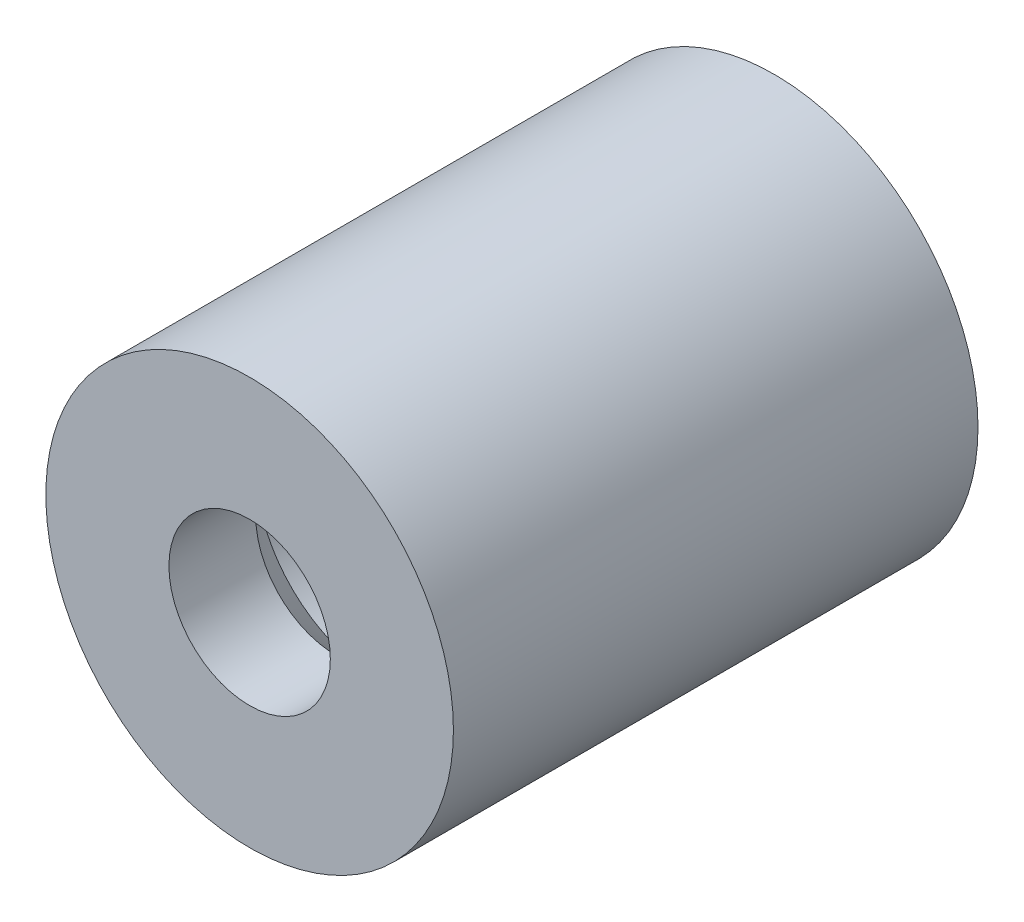
ISO-10303-21;
HEADER;
FILE_DESCRIPTION(('STEP AP214'),'2;1');
FILE_NAME('part.step','',(''),(''),'','','');
FILE_SCHEMA(('AUTOMOTIVE_DESIGN { 1 0 10303 214 1 1 1 1 }'));
ENDSEC;
DATA;
#1=APPLICATION_CONTEXT('core data for automotive mechanical design processes');
#2=APPLICATION_PROTOCOL_DEFINITION('international standard','automotive_design',2000,#1);
#3=PRODUCT_CONTEXT('',#1,'mechanical');
#4=PRODUCT('Part','Part','',(#3));
#5=PRODUCT_RELATED_PRODUCT_CATEGORY('part','',(#4));
#6=PRODUCT_DEFINITION_FORMATION('','',#4);
#7=PRODUCT_DEFINITION_CONTEXT('part definition',#1,'design');
#8=PRODUCT_DEFINITION('design','',#6,#7);
#9=PRODUCT_DEFINITION_SHAPE('','',#8);
#10=(LENGTH_UNIT() NAMED_UNIT(*) SI_UNIT(.MILLI.,.METRE.));
#11=(NAMED_UNIT(*) PLANE_ANGLE_UNIT() SI_UNIT($,.RADIAN.));
#12=(NAMED_UNIT(*) SI_UNIT($,.STERADIAN.) SOLID_ANGLE_UNIT());
#13=UNCERTAINTY_MEASURE_WITH_UNIT(LENGTH_MEASURE(1.E-05),#10,'distance_accuracy_value','');
#14=(GEOMETRIC_REPRESENTATION_CONTEXT(3) GLOBAL_UNCERTAINTY_ASSIGNED_CONTEXT((#13)) GLOBAL_UNIT_ASSIGNED_CONTEXT((#10,
#11,#12)) REPRESENTATION_CONTEXT('',''));
#15=CARTESIAN_POINT('',(0.,0.,0.));
#16=DIRECTION('',(0.,0.,1.));
#17=DIRECTION('',(1.,0.,0.));
#18=AXIS2_PLACEMENT_3D('',#15,#16,#17);
#19=CARTESIAN_POINT('',(0.,0.,11.));
#20=DIRECTION('',(0.,0.,-1.));
#21=DIRECTION('',(-1.,0.,0.));
#22=AXIS2_PLACEMENT_3D('',#19,#20,#21);
#23=CYLINDRICAL_SURFACE('',#22,3.05);
#24=CARTESIAN_POINT('',(0.,0.,9.79999999999998));
#25=DIRECTION('',(0.,0.,1.));
#26=DIRECTION('',(1.,0.,0.));
#27=AXIS2_PLACEMENT_3D('',#24,#25,#26);
#28=CIRCLE('',#27,3.05);
#29=CARTESIAN_POINT('',(-3.05,0.,9.79999999999998));
#30=VERTEX_POINT('',#29);
#31=EDGE_CURVE('E58',#30,#30,#28,.T.);
#32=ORIENTED_EDGE('',*,*,#31,.T.);
#33=EDGE_LOOP('',(#32));
#34=FACE_BOUND('',#33,.T.);
#35=CARTESIAN_POINT('',(0.,-3.05,4.6));
#36=CARTESIAN_POINT('',(-0.0836110050453581,-3.04999517700509,4.59999455650101));
#37=CARTESIAN_POINT('',(-0.167306428380569,-3.04652589814843,4.59340785872216));
#38=CARTESIAN_POINT('',(-0.332191821665101,-3.03298901559862,4.56736761047759));
#39=CARTESIAN_POINT('',(-0.41337744453983,-3.02291056912914,4.54789291591933));
#40=CARTESIAN_POINT('',(-0.570613153127324,-2.99720260155738,4.49706399807992));
#41=CARTESIAN_POINT('',(-0.64668239885405,-2.98159534164387,4.46575738147327));
#42=CARTESIAN_POINT('',(-0.792357900481189,-2.94623419512776,4.39241738866397));
#43=CARTESIAN_POINT('',(-0.861964263345972,-2.92648037717069,4.35038419003549));
#44=CARTESIAN_POINT('',(-0.997798318782131,-2.88310679073146,4.25371076067794));
#45=CARTESIAN_POINT('',(-1.06351666988197,-2.859319653945,4.19843117858787));
#46=CARTESIAN_POINT('',(-1.18522587445246,-2.81105572902165,4.07822360035397));
#47=CARTESIAN_POINT('',(-1.24120850706307,-2.78657837813787,4.01328753525379));
#48=CARTESIAN_POINT('',(-1.3467876012229,-2.73721560194913,3.86882083429098));
#49=CARTESIAN_POINT('',(-1.39539667719393,-2.71248186972032,3.78851034451157));
#50=CARTESIAN_POINT('',(-1.47821785577007,-2.66825595257666,3.61944545804245));
#51=CARTESIAN_POINT('',(-1.51244089981633,-2.64875978826508,3.53069754174642));
#52=CARTESIAN_POINT('',(-1.56317686282866,-2.61912187860583,3.35282461369514));
#53=CARTESIAN_POINT('',(-1.5806560469441,-2.60847521031483,3.26406395204097));
#54=CARTESIAN_POINT('',(-1.60032679539884,-2.59645976696876,3.08428674524894));
#55=CARTESIAN_POINT('',(-1.60253644934951,-2.59508001357605,2.99327299770228));
#56=CARTESIAN_POINT('',(-1.59231112345977,-2.60135681056238,2.82481316320863));
#57=CARTESIAN_POINT('',(-1.58181195806415,-2.60781918576659,2.74719343145767));
#58=CARTESIAN_POINT('',(-1.54985517155484,-2.62693591844801,2.59503685895057));
#59=CARTESIAN_POINT('',(-1.52839341169479,-2.63959261441304,2.5205011940298));
#60=CARTESIAN_POINT('',(-1.47477217782312,-2.66992681382473,2.37451021239191));
#61=CARTESIAN_POINT('',(-1.44237993660731,-2.68771221954179,2.30316388490232));
#62=CARTESIAN_POINT('',(-1.36800477135078,-2.7263193459757,2.16656234914093));
#63=CARTESIAN_POINT('',(-1.32601756253087,-2.74714242170351,2.10130988056908));
#64=CARTESIAN_POINT('',(-1.22673326593071,-2.79303030943981,1.96903155683991));
#65=CARTESIAN_POINT('',(-1.16811065163519,-2.81827847110633,1.90306057289718));
#66=CARTESIAN_POINT('',(-1.04059337899233,-2.86781214667249,1.78142080073434));
#67=CARTESIAN_POINT('',(-0.971692869974617,-2.89209710223632,1.72575792109897));
#68=CARTESIAN_POINT('',(-0.820740647513362,-2.93861464263574,1.6233543393171));
#69=CARTESIAN_POINT('',(-0.738169212285077,-2.96065672738557,1.57728596283712));
#70=CARTESIAN_POINT('',(-0.565004905102359,-2.99851580446222,1.50008897506982));
#71=CARTESIAN_POINT('',(-0.474419068631023,-3.01433819164323,1.46894741136602));
#72=CARTESIAN_POINT('',(-0.296343036097651,-3.03677685758856,1.42525207958017));
#73=CARTESIAN_POINT('',(-0.209283174619134,-3.04408137162577,1.41130246738174));
#74=CARTESIAN_POINT('',(-0.0337678143322873,-3.05107459307041,1.3979411600416));
#75=CARTESIAN_POINT('',(0.0546868918974522,-3.05076748003652,1.39852148648514));
#76=CARTESIAN_POINT('',(0.222261120633014,-3.04294690530863,1.41347654786282));
#77=CARTESIAN_POINT('',(0.301522473378709,-3.03606369806689,1.42664490565815));
#78=CARTESIAN_POINT('',(0.456527872639768,-3.01665136822864,1.46443893700297));
#79=CARTESIAN_POINT('',(0.532271546832611,-3.00412164948249,1.48906582033417));
#80=CARTESIAN_POINT('',(0.680409637622107,-2.97412294261102,1.5496154206314));
#81=CARTESIAN_POINT('',(0.752665352454752,-2.95653375763504,1.58581575597123));
#82=CARTESIAN_POINT('',(0.890294387704053,-2.91804565699983,1.6681537821101));
#83=CARTESIAN_POINT('',(0.955664928691706,-2.89714541318244,1.71429546334583));
#84=CARTESIAN_POINT('',(1.08498511623705,-2.85140171616678,1.82078716825914));
#85=CARTESIAN_POINT('',(1.14806026144041,-2.82637478821565,1.88212172109822));
#86=CARTESIAN_POINT('',(1.26345922508927,-2.77671130755486,2.01441119365976));
#87=CARTESIAN_POINT('',(1.31577375066828,-2.7520751090808,2.08537434160053));
#88=CARTESIAN_POINT('',(1.41129657900498,-2.70439793263665,2.2403745197948));
#89=CARTESIAN_POINT('',(1.45373748753615,-2.6815510703486,2.32494981651054));
#90=CARTESIAN_POINT('',(1.52334205942745,-2.64263875687894,2.50159483835204));
#91=CARTESIAN_POINT('',(1.55052704827709,-2.62656384740357,2.59365389503911));
#92=CARTESIAN_POINT('',(1.58620051535253,-2.60516086699517,2.77307748344927));
#93=CARTESIAN_POINT('',(1.59625878046835,-2.59893477717467,2.86001932668319));
#94=CARTESIAN_POINT('',(1.60200350958647,-2.59540043680358,3.03453714083777));
#95=CARTESIAN_POINT('',(1.59769866270163,-2.5980867945703,3.12211269639874));
#96=CARTESIAN_POINT('',(1.57634037251977,-2.6110861836083,3.28479140400219));
#97=CARTESIAN_POINT('',(1.56080020023768,-2.62049247072563,3.36017609553527));
#98=CARTESIAN_POINT('',(1.51941962429058,-2.64469943748282,3.5071449722835));
#99=CARTESIAN_POINT('',(1.49357556899147,-2.65950202938117,3.57872779993836));
#100=CARTESIAN_POINT('',(1.43045670677683,-2.69400519922494,3.7212953716003));
#101=CARTESIAN_POINT('',(1.39254346462315,-2.71396330851015,3.79193309027499));
#102=CARTESIAN_POINT('',(1.30701559790143,-2.7561720524641,3.9263162731664));
#103=CARTESIAN_POINT('',(1.25939575644109,-2.7784239167382,3.99005800275725));
#104=CARTESIAN_POINT('',(1.14810442822523,-2.82639569886052,4.118036575794));
#105=CARTESIAN_POINT('',(1.08312351653135,-2.85216935720769,4.18112091253596));
#106=CARTESIAN_POINT('',(0.942903791930803,-2.9015436493127,4.29581536913892));
#107=CARTESIAN_POINT('',(0.867658720167138,-2.92514294236523,4.3474184370686));
#108=CARTESIAN_POINT('',(0.706919773010004,-2.96813330877579,4.43838586255544));
#109=CARTESIAN_POINT('',(0.621256595958553,-2.98743470182243,4.47749570553711));
#110=CARTESIAN_POINT('',(0.443338336959858,-3.01894839595394,4.54022493559491));
#111=CARTESIAN_POINT('',(0.35110195214757,-3.03117996852047,4.5638864560046));
#112=CARTESIAN_POINT('',(0.214843288011331,-3.04272489307524,4.5860963019435));
#113=CARTESIAN_POINT('',(0.172094969544414,-3.04544427350963,4.59130106575374));
#114=CARTESIAN_POINT('',(0.0862385933399975,-3.04908308883221,4.59825435315199));
#115=CARTESIAN_POINT('',(0.0431305284664786,-3.0500024879299,4.60000280801538));
#116=CARTESIAN_POINT('',(0.,-3.05,4.6));
#117=B_SPLINE_CURVE_WITH_KNOTS('',3,(#35,#36,#37,#38,#39,#40,#41,#42,#43,#44,#45,#46,#47,#48,
#49,#50,#51,#52,#53,#54,#55,#56,#57,#58,#59,#60,#61,#62,#63,#64,#65,#66,#67,#68,#69,#70,#71,#72,
#73,#74,#75,#76,#77,#78,#79,#80,#81,#82,#83,#84,#85,#86,#87,#88,#89,#90,#91,#92,#93,#94,#95,#96,
#97,#98,#99,#100,#101,#102,#103,#104,#105,#106,#107,#108,#109,#110,#111,#112,#113,#114,#115,
#116),.UNSPECIFIED.,.T.,.F.,(4,2,2,2,2,2,2,2,2,2,2,2,2,2,2,2,2,2,2,2,2,2,2,2,2,2,2,2,2,2,2,2,2,
2,2,2,2,2,2,2,4),(0.,0.250658754208306,0.501729762912424,0.751801140503482,1.00186837853366,
1.26810210223369,1.53455955403315,1.82433168016992,2.1138830166977,2.38548666885169,
2.65676850048792,2.89144544038274,3.12621104423379,3.36632969040414,3.60655577548953,
3.88076383655907,4.15512858991027,4.44482381121524,4.73426719867742,4.99821133082684,
5.26201053397124,5.50282368426325,5.74366226518102,5.99077646561658,6.23799004262053,
6.51123596988036,6.78471689052737,7.07518363207381,7.36524332677427,7.62690724924094,
7.88841290412563,8.12003101787473,8.35173128875636,8.5986251672399,8.84565209243475,
9.12686877824567,9.40825771675036,9.69505938135874,9.98107552659207,10.1103746489914,
10.2396763423257),.UNSPECIFIED.);
#118=CARTESIAN_POINT('',(0.,-3.05,4.6));
#119=VERTEX_POINT('',#118);
#120=EDGE_CURVE('E78',#119,#119,#117,.T.);
#121=ORIENTED_EDGE('',*,*,#120,.T.);
#122=EDGE_LOOP('',(#121));
#123=FACE_BOUND('',#122,.T.);
#124=CARTESIAN_POINT('',(0.,0.,0.));
#125=DIRECTION('',(0.,0.,1.));
#126=DIRECTION('',(1.,0.,0.));
#127=AXIS2_PLACEMENT_3D('',#124,#125,#126);
#128=CIRCLE('',#127,3.05);
#129=CARTESIAN_POINT('',(3.05,0.,0.));
#130=VERTEX_POINT('',#129);
#131=EDGE_CURVE('E66',#130,#130,#128,.T.);
#132=ORIENTED_EDGE('',*,*,#131,.F.);
#133=EDGE_LOOP('',(#132));
#134=FACE_BOUND('',#133,.T.);
#135=ADVANCED_FACE('F50',(#34,#123,#134),#23,.F.);
#136=CARTESIAN_POINT('',(0.,0.,11.));
#137=DIRECTION('',(0.,0.,-1.));
#138=DIRECTION('',(-1.,0.,0.));
#139=AXIS2_PLACEMENT_3D('',#136,#137,#138);
#140=CYLINDRICAL_SURFACE('',#139,5.05);
#141=CARTESIAN_POINT('',(0.,-5.05,4.6));
#142=CARTESIAN_POINT('',(-0.0875409998517804,-5.04999968854448,4.5999996146656));
#143=CARTESIAN_POINT('',(-0.175086287920633,-5.04770234799848,4.59279192078489));
#144=CARTESIAN_POINT('',(-0.347612892298866,-5.03876311669709,4.56422970859236));
#145=CARTESIAN_POINT('',(-0.432593689370447,-5.03212035220745,4.54287234519592));
#146=CARTESIAN_POINT('',(-0.597478664125252,-5.0152151624065,4.48680601371964));
#147=CARTESIAN_POINT('',(-0.67739059958267,-5.00495843402861,4.45211805179648));
#148=CARTESIAN_POINT('',(-0.830263531219146,-4.98188185833633,4.37046569774811));
#149=CARTESIAN_POINT('',(-0.90322337097563,-4.96906158569309,4.32349926805046));
#150=CARTESIAN_POINT('',(-1.04243070697758,-4.94176252093728,4.21705899245297));
#151=CARTESIAN_POINT('',(-1.10842736008114,-4.92724685042671,4.15726658080544));
#152=CARTESIAN_POINT('',(-1.22964402275218,-4.89840438560033,4.02754970657174));
#153=CARTESIAN_POINT('',(-1.28486195453099,-4.88407762819619,3.95762329499609));
#154=CARTESIAN_POINT('',(-1.38432833222612,-4.85683738526605,3.8074342683838));
#155=CARTESIAN_POINT('',(-1.42826084216015,-4.84396930214838,3.72695339829055));
#156=CARTESIAN_POINT('',(-1.50186271557363,-4.82165928286893,3.55927206388807));
#157=CARTESIAN_POINT('',(-1.5315359557618,-4.8122164156552,3.47207343344476));
#158=CARTESIAN_POINT('',(-1.57485438998285,-4.79821225332726,3.29626706120927));
#159=CARTESIAN_POINT('',(-1.5889658831513,-4.79350932611333,3.20778581507909));
#160=CARTESIAN_POINT('',(-1.60221724513353,-4.7890973254852,3.029596248905));
#161=CARTESIAN_POINT('',(-1.6013612222925,-4.78938688171337,2.93988827233418));
#162=CARTESIAN_POINT('',(-1.58506601670005,-4.7948022964149,2.76567274496443));
#163=CARTESIAN_POINT('',(-1.57022273075002,-4.79973052457942,2.6811022730107));
#164=CARTESIAN_POINT('',(-1.5273417148178,-4.81354646727671,2.5157199720337));
#165=CARTESIAN_POINT('',(-1.49930254680973,-4.82243461333729,2.43490855370954));
#166=CARTESIAN_POINT('',(-1.4304112003053,-4.84331819883662,2.27793215859232));
#167=CARTESIAN_POINT('',(-1.38937406995172,-4.8553580260966,2.20185450965919));
#168=CARTESIAN_POINT('',(-1.29578011994086,-4.88116840659655,2.05747120183003));
#169=CARTESIAN_POINT('',(-1.24322023813672,-4.89493941947968,1.9891676162188));
#170=CARTESIAN_POINT('',(-1.12516129001637,-4.92345026245478,1.85890651262089));
#171=CARTESIAN_POINT('',(-1.05917123772441,-4.93820524930159,1.79739646767223));
#172=CARTESIAN_POINT('',(-0.917629342833674,-4.96645322355614,1.68620541900344));
#173=CARTESIAN_POINT('',(-0.84207675248564,-4.97994611212958,1.63652534121203));
#174=CARTESIAN_POINT('',(-0.682674541995491,-5.00429816452607,1.55008986762844));
#175=CARTESIAN_POINT('',(-0.598761930839947,-5.01513481017293,1.51344386387759));
#176=CARTESIAN_POINT('',(-0.42553949079506,-5.0327906775993,1.45492182414873));
#177=CARTESIAN_POINT('',(-0.336231357930901,-5.03961115464866,1.43304117288711));
#178=CARTESIAN_POINT('',(-0.158549216205161,-5.04826299817702,1.40543937401196));
#179=CARTESIAN_POINT('',(-0.0702782364883836,-5.05028121682763,1.39911269053774));
#180=CARTESIAN_POINT('',(0.106075060272594,-5.04965534675999,1.40108753632515));
#181=CARTESIAN_POINT('',(0.194157403732375,-5.04701196028328,1.40938686227019));
#182=CARTESIAN_POINT('',(0.365279611560941,-5.0374828084567,1.43989335678676));
#183=CARTESIAN_POINT('',(0.448390879495489,-5.03070772804667,1.46173790725958));
#184=CARTESIAN_POINT('',(0.609743470067217,-5.01371120490621,1.51827008960964));
#185=CARTESIAN_POINT('',(0.687984185017699,-5.00348933314512,1.55295932034886));
#186=CARTESIAN_POINT('',(0.839533508643948,-4.98033225342445,1.63515622181923));
#187=CARTESIAN_POINT('',(0.912671711288208,-4.967336049442,1.68296041508804));
#188=CARTESIAN_POINT('',(1.05009001051383,-4.94011399729062,1.78967605235402));
#189=CARTESIAN_POINT('',(1.11436763276413,-4.9258878074436,1.84859058809934));
#190=CARTESIAN_POINT('',(1.23496409977113,-4.89707747756121,1.97870307726973));
#191=CARTESIAN_POINT('',(1.29085118408187,-4.88250241727126,2.0503041471152));
#192=CARTESIAN_POINT('',(1.38985850179447,-4.85524863627326,2.20218459967792));
#193=CARTESIAN_POINT('',(1.4329788833825,-4.84256989355503,2.28246388165032));
#194=CARTESIAN_POINT('',(1.50497245295279,-4.82068224530988,2.44929242149736));
#195=CARTESIAN_POINT('',(1.53389615661281,-4.81146106489844,2.53581817284426));
#196=CARTESIAN_POINT('',(1.57665425573116,-4.79762193632171,2.71286555698321));
#197=CARTESIAN_POINT('',(1.59049460157207,-4.79300217295997,2.80338559935354));
#198=CARTESIAN_POINT('',(1.60225806319442,-4.78908166888636,2.98132820939418));
#199=CARTESIAN_POINT('',(1.60089112240371,-4.78954367677616,3.06869918501474));
#200=CARTESIAN_POINT('',(1.58399943980116,-4.79515621977543,3.24190040747531));
#201=CARTESIAN_POINT('',(1.56847539343717,-4.8003065245789,3.32773072978655));
#202=CARTESIAN_POINT('',(1.52419116959166,-4.81454729229537,3.4941057561264));
#203=CARTESIAN_POINT('',(1.49563955536881,-4.82357554295803,3.57471170399019));
#204=CARTESIAN_POINT('',(1.4262757502394,-4.84453755885023,3.73005300598049));
#205=CARTESIAN_POINT('',(1.38546101610392,-4.85647192667738,3.80478713830091));
#206=CARTESIAN_POINT('',(1.29081819118315,-4.88249787375329,3.94950506215417));
#207=CARTESIAN_POINT('',(1.23653428689882,-4.89665671833649,4.01917862356425));
#208=CARTESIAN_POINT('',(1.11728965206694,-4.9252327567763,4.14865736328875));
#209=CARTESIAN_POINT('',(1.0523260337656,-4.93965001956618,4.208459863717));
#210=CARTESIAN_POINT('',(0.910917163473966,-4.96770489289018,4.31853140841242));
#211=CARTESIAN_POINT('',(0.834157327015899,-4.98129950129264,4.36840851614646));
#212=CARTESIAN_POINT('',(0.672912830739476,-5.00562893309247,4.45448707960351));
#213=CARTESIAN_POINT('',(0.588431011791829,-5.01636480255978,4.49069353972337));
#214=CARTESIAN_POINT('',(0.420810428000111,-5.03308673421911,4.54599555233241));
#215=CARTESIAN_POINT('',(0.338062730395386,-5.03937316720542,4.56618760241644));
#216=CARTESIAN_POINT('',(0.170211030824961,-5.0478295068049,4.59318856783614));
#217=CARTESIAN_POINT('',(0.0851075419742984,-5.0500003027977,4.6000003746229));
#218=CARTESIAN_POINT('',(0.,-5.05,4.6));
#219=B_SPLINE_CURVE_WITH_KNOTS('',3,(#141,#142,#143,#144,#145,#146,#147,#148,#149,#150,#151,
#152,#153,#154,#155,#156,#157,#158,#159,#160,#161,#162,#163,#164,#165,#166,#167,#168,#169,#170,
#171,#172,#173,#174,#175,#176,#177,#178,#179,#180,#181,#182,#183,#184,#185,#186,#187,#188,#189,
#190,#191,#192,#193,#194,#195,#196,#197,#198,#199,#200,#201,#202,#203,#204,#205,#206,#207,#208,
#209,#210,#211,#212,#213,#214,#215,#216,#217,#218),.UNSPECIFIED.,.T.,.F.,(4,2,2,2,2,2,2,2,2,2,2,
2,2,2,2,2,2,2,2,2,2,2,2,2,2,2,2,2,2,2,2,2,2,2,2,2,2,2,4),(0.,0.26231009795066,0.524672954802164,
0.786624068287109,1.04861867934494,1.31808687701071,1.58760696823898,1.86400585528101,
2.14032955438771,2.40812721536418,2.67585137129476,2.93266190253404,3.18950042627366,
3.45017148345105,3.71091189756461,3.98387288240288,4.25685522481546,4.53207739652838,
4.80721350070717,5.07145551433442,5.33565772496239,5.59307537752534,5.85052508333707,
6.11435862531181,6.37826569461112,6.65294103623153,6.92761318950491,7.20130076762507,
7.47488033690594,7.73574371977935,7.99659428879707,8.25340788149735,8.5102747711651,
8.7774316973907,9.04466098100359,9.3209498631635,9.5971375063127,9.85221105573486,
10.1072294780674),.UNSPECIFIED.);
#220=CARTESIAN_POINT('',(0.,-5.05,4.6));
#221=VERTEX_POINT('',#220);
#222=EDGE_CURVE('E77',#221,#221,#219,.T.);
#223=ORIENTED_EDGE('',*,*,#222,.F.);
#224=EDGE_LOOP('',(#223));
#225=FACE_BOUND('',#224,.T.);
#226=CARTESIAN_POINT('',(0.,0.,0.));
#227=DIRECTION('',(0.,0.,1.));
#228=DIRECTION('',(1.,0.,0.));
#229=AXIS2_PLACEMENT_3D('',#226,#227,#228);
#230=CIRCLE('',#229,5.05);
#231=CARTESIAN_POINT('',(5.05,0.,0.));
#232=VERTEX_POINT('',#231);
#233=EDGE_CURVE('E62',#232,#232,#230,.T.);
#234=ORIENTED_EDGE('',*,*,#233,.T.);
#235=EDGE_LOOP('',(#234));
#236=FACE_BOUND('',#235,.T.);
#237=CARTESIAN_POINT('',(0.,0.,13.));
#238=DIRECTION('',(0.,0.,1.));
#239=DIRECTION('',(1.,0.,0.));
#240=AXIS2_PLACEMENT_3D('',#237,#238,#239);
#241=CIRCLE('',#240,5.05);
#242=CARTESIAN_POINT('',(5.05,0.,13.));
#243=VERTEX_POINT('',#242);
#244=EDGE_CURVE('E71',#243,#243,#241,.T.);
#245=ORIENTED_EDGE('',*,*,#244,.F.);
#246=EDGE_LOOP('',(#245));
#247=FACE_BOUND('',#246,.T.);
#248=ADVANCED_FACE('F108',(#225,#236,#247),#140,.T.);
#249=CARTESIAN_POINT('',(0.,0.,0.));
#250=DIRECTION('',(0.,0.,1.));
#251=DIRECTION('',(1.,0.,0.));
#252=AXIS2_PLACEMENT_3D('',#249,#250,#251);
#253=PLANE('',#252);
#254=ORIENTED_EDGE('',*,*,#131,.T.);
#255=EDGE_LOOP('',(#254));
#256=FACE_BOUND('',#255,.T.);
#257=ORIENTED_EDGE('',*,*,#233,.F.);
#258=EDGE_LOOP('',(#257));
#259=FACE_BOUND('',#258,.T.);
#260=ADVANCED_FACE('F104',(#256,#259),#253,.F.);
#261=CARTESIAN_POINT('',(0.,0.,13.));
#262=DIRECTION('',(0.,0.,1.));
#263=DIRECTION('',(1.,0.,0.));
#264=AXIS2_PLACEMENT_3D('',#261,#262,#263);
#265=PLANE('',#264);
#266=ORIENTED_EDGE('',*,*,#244,.T.);
#267=EDGE_LOOP('',(#266));
#268=FACE_BOUND('',#267,.T.);
#269=CARTESIAN_POINT('',(0.,0.,13.));
#270=DIRECTION('',(0.,0.,1.));
#271=DIRECTION('',(1.,0.,0.));
#272=AXIS2_PLACEMENT_3D('',#269,#270,#271);
#273=CIRCLE('',#272,2.);
#274=CARTESIAN_POINT('',(2.,0.,13.));
#275=VERTEX_POINT('',#274);
#276=EDGE_CURVE('E74',#275,#275,#273,.T.);
#277=ORIENTED_EDGE('',*,*,#276,.F.);
#278=EDGE_LOOP('',(#277));
#279=FACE_BOUND('',#278,.T.);
#280=ADVANCED_FACE('F101',(#268,#279),#265,.T.);
#281=CARTESIAN_POINT('',(0.,0.,13.));
#282=DIRECTION('',(0.,0.,-1.));
#283=DIRECTION('',(-1.,0.,0.));
#284=AXIS2_PLACEMENT_3D('',#281,#282,#283);
#285=CYLINDRICAL_SURFACE('',#284,2.);
#286=CARTESIAN_POINT('',(0.,0.,10.85));
#287=DIRECTION('',(0.,0.,-1.));
#288=DIRECTION('',(-1.,0.,0.));
#289=AXIS2_PLACEMENT_3D('',#286,#287,#288);
#290=CIRCLE('',#289,2.);
#291=CARTESIAN_POINT('',(-2.,0.,10.85));
#292=VERTEX_POINT('',#291);
#293=EDGE_CURVE('E11',#292,#292,#290,.T.);
#294=ORIENTED_EDGE('',*,*,#293,.T.);
#295=EDGE_LOOP('',(#294));
#296=FACE_BOUND('',#295,.T.);
#297=ORIENTED_EDGE('',*,*,#276,.T.);
#298=EDGE_LOOP('',(#297));
#299=FACE_BOUND('',#298,.T.);
#300=ADVANCED_FACE('F96',(#296,#299),#285,.F.);
#301=CARTESIAN_POINT('',(0.,-5.051,3.));
#302=DIRECTION('',(0.,1.,0.));
#303=DIRECTION('',(0.,0.,1.));
#304=AXIS2_PLACEMENT_3D('',#301,#302,#303);
#305=CYLINDRICAL_SURFACE('',#304,1.6);
#306=ORIENTED_EDGE('',*,*,#120,.F.);
#307=EDGE_LOOP('',(#306));
#308=FACE_BOUND('',#307,.T.);
#309=ORIENTED_EDGE('',*,*,#222,.T.);
#310=EDGE_LOOP('',(#309));
#311=FACE_BOUND('',#310,.T.);
#312=ADVANCED_FACE('F90',(#308,#311),#305,.F.);
#313=CARTESIAN_POINT('',(0.,0.,9.79999999999998));
#314=DIRECTION('',(0.,0.,-1.));
#315=DIRECTION('',(-1.,0.,0.));
#316=AXIS2_PLACEMENT_3D('',#313,#314,#315);
#317=CONICAL_SURFACE('',#316,3.05,0.785398163397443);
#318=CARTESIAN_POINT('',(-2.,0.,10.85));
#319=CARTESIAN_POINT('',(-2.0109375,0.,10.8390625));
#320=CARTESIAN_POINT('',(-2.021875,0.,10.828125));
#321=CARTESIAN_POINT('',(-2.04375,0.,10.80625));
#322=CARTESIAN_POINT('',(-2.0546875,0.,10.7953125));
#323=CARTESIAN_POINT('',(-2.0765625,0.,10.7734375));
#324=CARTESIAN_POINT('',(-2.0875,0.,10.7625));
#325=CARTESIAN_POINT('',(-2.109375,0.,10.740625));
#326=CARTESIAN_POINT('',(-2.1203125,0.,10.7296875));
#327=CARTESIAN_POINT('',(-2.1421875,0.,10.7078125));
#328=CARTESIAN_POINT('',(-2.153125,0.,10.696875));
#329=CARTESIAN_POINT('',(-2.175,0.,10.675));
#330=CARTESIAN_POINT('',(-2.1859375,0.,10.6640625));
#331=CARTESIAN_POINT('',(-2.2078125,0.,10.6421875));
#332=CARTESIAN_POINT('',(-2.21875,0.,10.63125));
#333=CARTESIAN_POINT('',(-2.240625,0.,10.609375));
#334=CARTESIAN_POINT('',(-2.2515625,0.,10.5984375));
#335=CARTESIAN_POINT('',(-2.2734375,0.,10.5765625));
#336=CARTESIAN_POINT('',(-2.284375,0.,10.565625));
#337=CARTESIAN_POINT('',(-2.30625,0.,10.54375));
#338=CARTESIAN_POINT('',(-2.3171875,0.,10.5328125));
#339=CARTESIAN_POINT('',(-2.3390625,0.,10.5109375));
#340=CARTESIAN_POINT('',(-2.35,0.,10.5));
#341=CARTESIAN_POINT('',(-2.371875,0.,10.478125));
#342=CARTESIAN_POINT('',(-2.3828125,0.,10.4671875));
#343=CARTESIAN_POINT('',(-2.4046875,0.,10.4453125));
#344=CARTESIAN_POINT('',(-2.415625,0.,10.434375));
#345=CARTESIAN_POINT('',(-2.4375,0.,10.4125));
#346=CARTESIAN_POINT('',(-2.4484375,0.,10.4015625));
#347=CARTESIAN_POINT('',(-2.4703125,0.,10.3796875));
#348=CARTESIAN_POINT('',(-2.48125,0.,10.36875));
#349=CARTESIAN_POINT('',(-2.503125,0.,10.346875));
#350=CARTESIAN_POINT('',(-2.5140625,0.,10.3359375));
#351=CARTESIAN_POINT('',(-2.5359375,0.,10.3140625));
#352=CARTESIAN_POINT('',(-2.546875,0.,10.303125));
#353=CARTESIAN_POINT('',(-2.56875,0.,10.28125));
#354=CARTESIAN_POINT('',(-2.5796875,0.,10.2703125));
#355=CARTESIAN_POINT('',(-2.6015625,0.,10.2484375));
#356=CARTESIAN_POINT('',(-2.6125,0.,10.2375));
#357=CARTESIAN_POINT('',(-2.634375,0.,10.215625));
#358=CARTESIAN_POINT('',(-2.6453125,0.,10.2046875));
#359=CARTESIAN_POINT('',(-2.6671875,0.,10.1828125));
#360=CARTESIAN_POINT('',(-2.678125,0.,10.171875));
#361=CARTESIAN_POINT('',(-2.7,0.,10.15));
#362=CARTESIAN_POINT('',(-2.7109375,0.,10.1390625));
#363=CARTESIAN_POINT('',(-2.7328125,0.,10.1171875));
#364=CARTESIAN_POINT('',(-2.74375,0.,10.10625));
#365=CARTESIAN_POINT('',(-2.765625,0.,10.084375));
#366=CARTESIAN_POINT('',(-2.7765625,0.,10.0734375));
#367=CARTESIAN_POINT('',(-2.7984375,0.,10.0515625));
#368=CARTESIAN_POINT('',(-2.809375,0.,10.040625));
#369=CARTESIAN_POINT('',(-2.83125,0.,10.01875));
#370=CARTESIAN_POINT('',(-2.8421875,0.,10.0078125));
#371=CARTESIAN_POINT('',(-2.8640625,0.,9.98593749999998));
#372=CARTESIAN_POINT('',(-2.875,0.,9.97499999999998));
#373=CARTESIAN_POINT('',(-2.896875,0.,9.95312499999998));
#374=CARTESIAN_POINT('',(-2.9078125,0.,9.94218749999998));
#375=CARTESIAN_POINT('',(-2.9296875,0.,9.92031249999998));
#376=CARTESIAN_POINT('',(-2.940625,0.,9.90937499999998));
#377=CARTESIAN_POINT('',(-2.9625,0.,9.88749999999998));
#378=CARTESIAN_POINT('',(-2.9734375,0.,9.87656249999998));
#379=CARTESIAN_POINT('',(-2.9953125,0.,9.85468749999998));
#380=CARTESIAN_POINT('',(-3.00625,0.,9.84374999999998));
#381=CARTESIAN_POINT('',(-3.028125,0.,9.82187499999998));
#382=CARTESIAN_POINT('',(-3.0390625,0.,9.81093749999998));
#383=CARTESIAN_POINT('',(-3.05,0.,9.79999999999998));
#384=B_SPLINE_CURVE_WITH_KNOTS('',3,(#318,#319,#320,#321,#322,#323,#324,#325,#326,#327,#328,
#329,#330,#331,#332,#333,#334,#335,#336,#337,#338,#339,#340,#341,#342,#343,#344,#345,#346,#347,
#348,#349,#350,#351,#352,#353,#354,#355,#356,#357,#358,#359,#360,#361,#362,#363,#364,#365,#366,
#367,#368,#369,#370,#371,#372,#373,#374,#375,#376,#377,#378,#379,#380,#381,#382,#383),
.UNSPECIFIED.,.F.,.F.,(4,2,2,2,2,2,2,2,2,2,2,2,2,2,2,2,2,2,2,2,2,2,2,2,2,2,2,2,2,2,2,2,4),(0.,
0.0464038825153682,0.0928077650307352,0.139211647546102,0.185615530061469,0.232019412576838,
0.278423295092205,0.324827177607572,0.37123106012294,0.417634942638307,0.464038825153674,
0.510442707669042,0.55684659018441,0.603250472699777,0.649654355215144,0.696058237730512,
0.74246212024588,0.788866002761247,0.835269885276613,0.881673767791982,0.928077650307349,
0.974481532822716,1.02088541533808,1.06728929785345,1.11369318036882,1.16009706288419,
1.20650094539955,1.25290482791492,1.29930871043029,1.34571259294566,1.39211647546102,
1.43852035797639,1.48492424049176),.UNSPECIFIED.);
#385=EDGE_CURVE('BSEAM53',#292,#30,#384,.T.);
#386=ORIENTED_EDGE('',*,*,#293,.F.);
#387=ORIENTED_EDGE('',*,*,#31,.F.);
#388=ORIENTED_EDGE('',*,*,#385,.T.);
#389=ORIENTED_EDGE('',*,*,#385,.F.);
#390=EDGE_LOOP('',(#386,#388,#387,#389));
#391=FACE_BOUND('',#390,.T.);
#392=ADVANCED_FACE('F53',(#391),#317,.F.);
#393=CLOSED_SHELL('',(#135,#248,#260,#280,#300,#312,#392));
#394=MANIFOLD_SOLID_BREP('B2',#393);
#395=ADVANCED_BREP_SHAPE_REPRESENTATION('',(#18,#394),#14);
#396=SHAPE_DEFINITION_REPRESENTATION(#9,#395);
ENDSEC;
END-ISO-10303-21;
